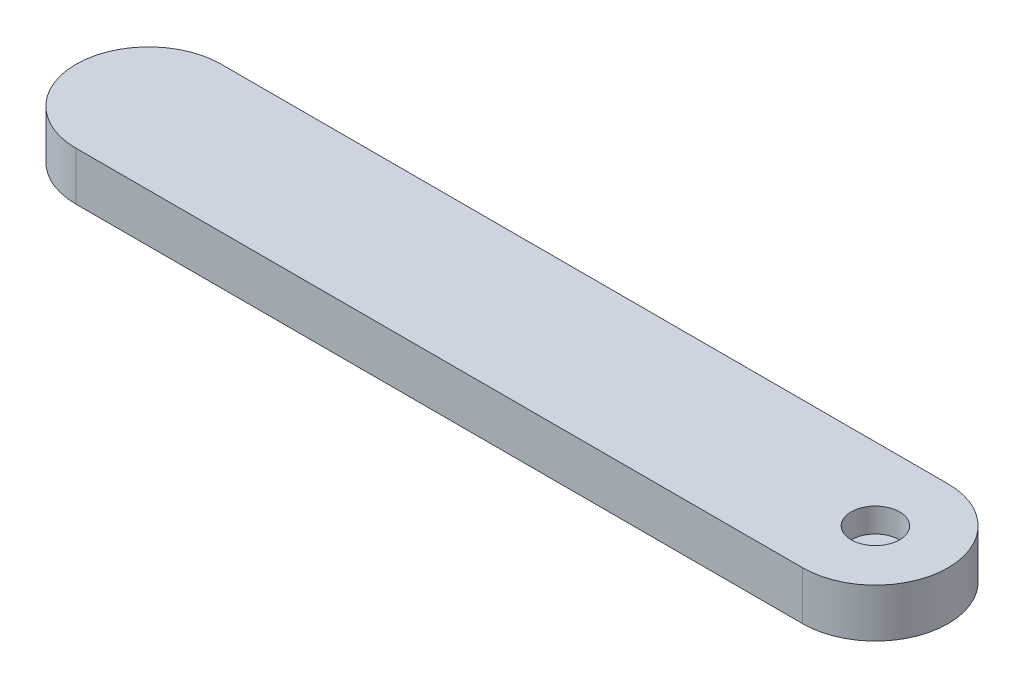
ISO-10303-21;
HEADER;
FILE_DESCRIPTION(('STEP AP214'),'2;1');
FILE_NAME('part.step','',(''),(''),'','','');
FILE_SCHEMA(('AUTOMOTIVE_DESIGN { 1 0 10303 214 1 1 1 1 }'));
ENDSEC;
DATA;
#1=APPLICATION_CONTEXT('core data for automotive mechanical design processes');
#2=APPLICATION_PROTOCOL_DEFINITION('international standard','automotive_design',2000,#1);
#3=PRODUCT_CONTEXT('',#1,'mechanical');
#4=PRODUCT('Part','Part','',(#3));
#5=PRODUCT_RELATED_PRODUCT_CATEGORY('part','',(#4));
#6=PRODUCT_DEFINITION_FORMATION('','',#4);
#7=PRODUCT_DEFINITION_CONTEXT('part definition',#1,'design');
#8=PRODUCT_DEFINITION('design','',#6,#7);
#9=PRODUCT_DEFINITION_SHAPE('','',#8);
#10=(LENGTH_UNIT() NAMED_UNIT(*) SI_UNIT(.MILLI.,.METRE.));
#11=(NAMED_UNIT(*) PLANE_ANGLE_UNIT() SI_UNIT($,.RADIAN.));
#12=(NAMED_UNIT(*) SI_UNIT($,.STERADIAN.) SOLID_ANGLE_UNIT());
#13=UNCERTAINTY_MEASURE_WITH_UNIT(LENGTH_MEASURE(1.E-05),#10,'distance_accuracy_value','');
#14=(GEOMETRIC_REPRESENTATION_CONTEXT(3) GLOBAL_UNCERTAINTY_ASSIGNED_CONTEXT((#13)) GLOBAL_UNIT_ASSIGNED_CONTEXT((#10,
#11,#12)) REPRESENTATION_CONTEXT('',''));
#15=CARTESIAN_POINT('',(0.,0.,0.));
#16=DIRECTION('',(0.,0.,1.));
#17=DIRECTION('',(1.,0.,0.));
#18=AXIS2_PLACEMENT_3D('',#15,#16,#17);
#19=CARTESIAN_POINT('',(0.,100.,0.));
#20=DIRECTION('',(0.,-1.,0.));
#21=DIRECTION('',(0.,0.,-1.));
#22=AXIS2_PLACEMENT_3D('',#19,#20,#21);
#23=CYLINDRICAL_SURFACE('',#22,150.);
#24=CARTESIAN_POINT('',(0.,0.,0.));
#25=DIRECTION('',(0.,1.,0.));
#26=DIRECTION('',(0.,0.,1.));
#27=AXIS2_PLACEMENT_3D('',#24,#25,#26);
#28=CIRCLE('',#27,150.);
#29=CARTESIAN_POINT('',(0.,0.,-150.));
#30=VERTEX_POINT('',#29);
#31=CARTESIAN_POINT('',(0.,0.,150.));
#32=VERTEX_POINT('',#31);
#33=EDGE_CURVE('E98',#30,#32,#28,.T.);
#34=ORIENTED_EDGE('',*,*,#33,.T.);
#35=DIRECTION('',(0.,-1.,0.));
#36=VECTOR('',#35,1.);
#37=CARTESIAN_POINT('',(0.,100.,150.));
#38=LINE('',#37,#36);
#39=CARTESIAN_POINT('',(0.,100.,150.));
#40=VERTEX_POINT('',#39);
#41=EDGE_CURVE('E40',#40,#32,#38,.T.);
#42=ORIENTED_EDGE('',*,*,#41,.F.);
#43=CARTESIAN_POINT('',(0.,100.,0.));
#44=DIRECTION('',(0.,1.,0.));
#45=DIRECTION('',(0.,0.,1.));
#46=AXIS2_PLACEMENT_3D('',#43,#44,#45);
#47=CIRCLE('',#46,150.);
#48=CARTESIAN_POINT('',(0.,100.,-150.));
#49=VERTEX_POINT('',#48);
#50=EDGE_CURVE('E84',#49,#40,#47,.T.);
#51=ORIENTED_EDGE('',*,*,#50,.F.);
#52=DIRECTION('',(0.,-1.,0.));
#53=VECTOR('',#52,1.);
#54=CARTESIAN_POINT('',(0.,100.,-150.));
#55=LINE('',#54,#53);
#56=EDGE_CURVE('E94',#49,#30,#55,.T.);
#57=ORIENTED_EDGE('',*,*,#56,.T.);
#58=EDGE_LOOP('',(#34,#42,#51,#57));
#59=FACE_BOUND('',#58,.T.);
#60=ADVANCED_FACE('F32',(#59),#23,.T.);
#61=CARTESIAN_POINT('',(0.,100.,150.));
#62=DIRECTION('',(0.,0.,-1.));
#63=DIRECTION('',(-1.,0.,0.));
#64=AXIS2_PLACEMENT_3D('',#61,#62,#63);
#65=PLANE('',#64);
#66=DIRECTION('',(1.,0.,0.));
#67=VECTOR('',#66,1.);
#68=CARTESIAN_POINT('',(0.,0.,150.));
#69=LINE('',#68,#67);
#70=CARTESIAN_POINT('',(1500.,0.,150.));
#71=VERTEX_POINT('',#70);
#72=EDGE_CURVE('E89',#32,#71,#69,.T.);
#73=ORIENTED_EDGE('',*,*,#72,.T.);
#74=DIRECTION('',(0.,-1.,0.));
#75=VECTOR('',#74,1.);
#76=CARTESIAN_POINT('',(1500.,100.,150.));
#77=LINE('',#76,#75);
#78=CARTESIAN_POINT('',(1500.,100.,150.));
#79=VERTEX_POINT('',#78);
#80=EDGE_CURVE('E87',#79,#71,#77,.T.);
#81=ORIENTED_EDGE('',*,*,#80,.F.);
#82=DIRECTION('',(1.,0.,0.));
#83=VECTOR('',#82,1.);
#84=CARTESIAN_POINT('',(0.,100.,150.));
#85=LINE('',#84,#83);
#86=EDGE_CURVE('E79',#40,#79,#85,.T.);
#87=ORIENTED_EDGE('',*,*,#86,.F.);
#88=ORIENTED_EDGE('',*,*,#41,.T.);
#89=EDGE_LOOP('',(#73,#81,#87,#88));
#90=FACE_BOUND('',#89,.T.);
#91=ADVANCED_FACE('F88',(#90),#65,.F.);
#92=CARTESIAN_POINT('',(1500.,100.,0.));
#93=DIRECTION('',(0.,-1.,0.));
#94=DIRECTION('',(0.,0.,-1.));
#95=AXIS2_PLACEMENT_3D('',#92,#93,#94);
#96=CYLINDRICAL_SURFACE('',#95,150.);
#97=CARTESIAN_POINT('',(1500.,0.,0.));
#98=DIRECTION('',(0.,1.,0.));
#99=DIRECTION('',(0.,0.,1.));
#100=AXIS2_PLACEMENT_3D('',#97,#98,#99);
#101=CIRCLE('',#100,150.);
#102=CARTESIAN_POINT('',(1500.,0.,-150.));
#103=VERTEX_POINT('',#102);
#104=EDGE_CURVE('E65',#71,#103,#101,.T.);
#105=ORIENTED_EDGE('',*,*,#104,.T.);
#106=DIRECTION('',(0.,-1.,0.));
#107=VECTOR('',#106,1.);
#108=CARTESIAN_POINT('',(1500.,100.,-150.));
#109=LINE('',#108,#107);
#110=CARTESIAN_POINT('',(1500.,100.,-150.));
#111=VERTEX_POINT('',#110);
#112=EDGE_CURVE('E90',#111,#103,#109,.T.);
#113=ORIENTED_EDGE('',*,*,#112,.F.);
#114=CARTESIAN_POINT('',(1500.,100.,0.));
#115=DIRECTION('',(0.,1.,0.));
#116=DIRECTION('',(0.,0.,1.));
#117=AXIS2_PLACEMENT_3D('',#114,#115,#116);
#118=CIRCLE('',#117,150.);
#119=EDGE_CURVE('E82',#79,#111,#118,.T.);
#120=ORIENTED_EDGE('',*,*,#119,.F.);
#121=ORIENTED_EDGE('',*,*,#80,.T.);
#122=EDGE_LOOP('',(#105,#113,#120,#121));
#123=FACE_BOUND('',#122,.T.);
#124=ADVANCED_FACE('F92',(#123),#96,.T.);
#125=CARTESIAN_POINT('',(0.,100.,-150.));
#126=DIRECTION('',(0.,0.,1.));
#127=DIRECTION('',(1.,0.,0.));
#128=AXIS2_PLACEMENT_3D('',#125,#126,#127);
#129=PLANE('',#128);
#130=DIRECTION('',(-1.,0.,0.));
#131=VECTOR('',#130,1.);
#132=CARTESIAN_POINT('',(0.,0.,-150.));
#133=LINE('',#132,#131);
#134=EDGE_CURVE('E71',#103,#30,#133,.T.);
#135=ORIENTED_EDGE('',*,*,#134,.T.);
#136=ORIENTED_EDGE('',*,*,#56,.F.);
#137=DIRECTION('',(-1.,0.,0.));
#138=VECTOR('',#137,1.);
#139=CARTESIAN_POINT('',(0.,100.,-150.));
#140=LINE('',#139,#138);
#141=EDGE_CURVE('E48',#111,#49,#140,.T.);
#142=ORIENTED_EDGE('',*,*,#141,.F.);
#143=ORIENTED_EDGE('',*,*,#112,.T.);
#144=EDGE_LOOP('',(#135,#136,#142,#143));
#145=FACE_BOUND('',#144,.T.);
#146=ADVANCED_FACE('F121',(#145),#129,.F.);
#147=CARTESIAN_POINT('',(0.,100.,0.));
#148=DIRECTION('',(0.,1.,0.));
#149=DIRECTION('',(0.,0.,1.));
#150=AXIS2_PLACEMENT_3D('',#147,#148,#149);
#151=PLANE('',#150);
#152=CARTESIAN_POINT('',(1500.,100.,0.));
#153=DIRECTION('',(0.,1.,0.));
#154=DIRECTION('',(0.,0.,1.));
#155=AXIS2_PLACEMENT_3D('',#152,#153,#154);
#156=CIRCLE('',#155,50.);
#157=CARTESIAN_POINT('',(1500.,100.,50.));
#158=VERTEX_POINT('',#157);
#159=EDGE_CURVE('E181',#158,#158,#156,.T.);
#160=ORIENTED_EDGE('',*,*,#159,.F.);
#161=EDGE_LOOP('',(#160));
#162=FACE_BOUND('',#161,.T.);
#163=ORIENTED_EDGE('',*,*,#50,.T.);
#164=ORIENTED_EDGE('',*,*,#86,.T.);
#165=ORIENTED_EDGE('',*,*,#119,.T.);
#166=ORIENTED_EDGE('',*,*,#141,.T.);
#167=EDGE_LOOP('',(#163,#164,#165,#166));
#168=FACE_BOUND('',#167,.T.);
#169=ADVANCED_FACE('F80',(#162,#168),#151,.T.);
#170=CARTESIAN_POINT('',(0.,0.,0.));
#171=DIRECTION('',(0.,1.,0.));
#172=DIRECTION('',(0.,0.,1.));
#173=AXIS2_PLACEMENT_3D('',#170,#171,#172);
#174=PLANE('',#173);
#175=CARTESIAN_POINT('',(0.,0.,0.));
#176=DIRECTION('',(0.,1.,0.));
#177=DIRECTION('',(0.,0.,1.));
#178=AXIS2_PLACEMENT_3D('',#175,#176,#177);
#179=CIRCLE('',#178,50.);
#180=CARTESIAN_POINT('',(0.,0.,50.));
#181=VERTEX_POINT('',#180);
#182=EDGE_CURVE('E11',#181,#181,#179,.F.);
#183=ORIENTED_EDGE('',*,*,#182,.F.);
#184=EDGE_LOOP('',(#183));
#185=FACE_BOUND('',#184,.T.);
#186=ORIENTED_EDGE('',*,*,#33,.F.);
#187=ORIENTED_EDGE('',*,*,#134,.F.);
#188=ORIENTED_EDGE('',*,*,#104,.F.);
#189=ORIENTED_EDGE('',*,*,#72,.F.);
#190=EDGE_LOOP('',(#186,#187,#188,#189));
#191=FACE_BOUND('',#190,.T.);
#192=ADVANCED_FACE('F109',(#185,#191),#174,.F.);
#193=CARTESIAN_POINT('',(0.,-100.,0.));
#194=DIRECTION('',(0.,1.,0.));
#195=DIRECTION('',(0.,0.,1.));
#196=AXIS2_PLACEMENT_3D('',#193,#194,#195);
#197=CYLINDRICAL_SURFACE('',#196,50.);
#198=CARTESIAN_POINT('',(0.,-100.,0.));
#199=DIRECTION('',(0.,-1.,0.));
#200=DIRECTION('',(0.,0.,-1.));
#201=AXIS2_PLACEMENT_3D('',#198,#199,#200);
#202=CIRCLE('',#201,50.);
#203=CARTESIAN_POINT('',(0.,-100.,-50.));
#204=VERTEX_POINT('',#203);
#205=EDGE_CURVE('E101',#204,#204,#202,.T.);
#206=ORIENTED_EDGE('',*,*,#205,.F.);
#207=EDGE_LOOP('',(#206));
#208=FACE_BOUND('',#207,.T.);
#209=ORIENTED_EDGE('',*,*,#182,.T.);
#210=EDGE_LOOP('',(#209));
#211=FACE_BOUND('',#210,.T.);
#212=ADVANCED_FACE('F111',(#208,#211),#197,.T.);
#213=CARTESIAN_POINT('',(0.,-100.,0.));
#214=DIRECTION('',(0.,-1.,0.));
#215=DIRECTION('',(0.,0.,-1.));
#216=AXIS2_PLACEMENT_3D('',#213,#214,#215);
#217=PLANE('',#216);
#218=ORIENTED_EDGE('',*,*,#205,.T.);
#219=EDGE_LOOP('',(#218));
#220=FACE_BOUND('',#219,.T.);
#221=ADVANCED_FACE('F118',(#220),#217,.T.);
#222=CARTESIAN_POINT('',(1500.,50.,0.));
#223=DIRECTION('',(0.,1.,0.));
#224=DIRECTION('',(0.,0.,1.));
#225=AXIS2_PLACEMENT_3D('',#222,#223,#224);
#226=CYLINDRICAL_SURFACE('',#225,50.);
#227=CARTESIAN_POINT('',(1500.,50.,0.));
#228=DIRECTION('',(0.,1.,0.));
#229=DIRECTION('',(0.,0.,1.));
#230=AXIS2_PLACEMENT_3D('',#227,#228,#229);
#231=CIRCLE('',#230,50.);
#232=CARTESIAN_POINT('',(1500.,50.,50.));
#233=VERTEX_POINT('',#232);
#234=EDGE_CURVE('E179',#233,#233,#231,.T.);
#235=ORIENTED_EDGE('',*,*,#234,.F.);
#236=EDGE_LOOP('',(#235));
#237=FACE_BOUND('',#236,.T.);
#238=ORIENTED_EDGE('',*,*,#159,.T.);
#239=EDGE_LOOP('',(#238));
#240=FACE_BOUND('',#239,.T.);
#241=ADVANCED_FACE('F154',(#237,#240),#226,.F.);
#242=CARTESIAN_POINT('',(1500.,50.,0.));
#243=DIRECTION('',(0.,1.,0.));
#244=DIRECTION('',(0.,0.,1.));
#245=AXIS2_PLACEMENT_3D('',#242,#243,#244);
#246=PLANE('',#245);
#247=ORIENTED_EDGE('',*,*,#234,.T.);
#248=EDGE_LOOP('',(#247));
#249=FACE_BOUND('',#248,.T.);
#250=ADVANCED_FACE('F159',(#249),#246,.T.);
#251=CLOSED_SHELL('',(#60,#91,#124,#146,#169,#192,#212,#221,#241,#250));
#252=MANIFOLD_SOLID_BREP('B2',#251);
#253=ADVANCED_BREP_SHAPE_REPRESENTATION('',(#18,#252),#14);
#254=SHAPE_DEFINITION_REPRESENTATION(#9,#253);
ENDSEC;
END-ISO-10303-21;
